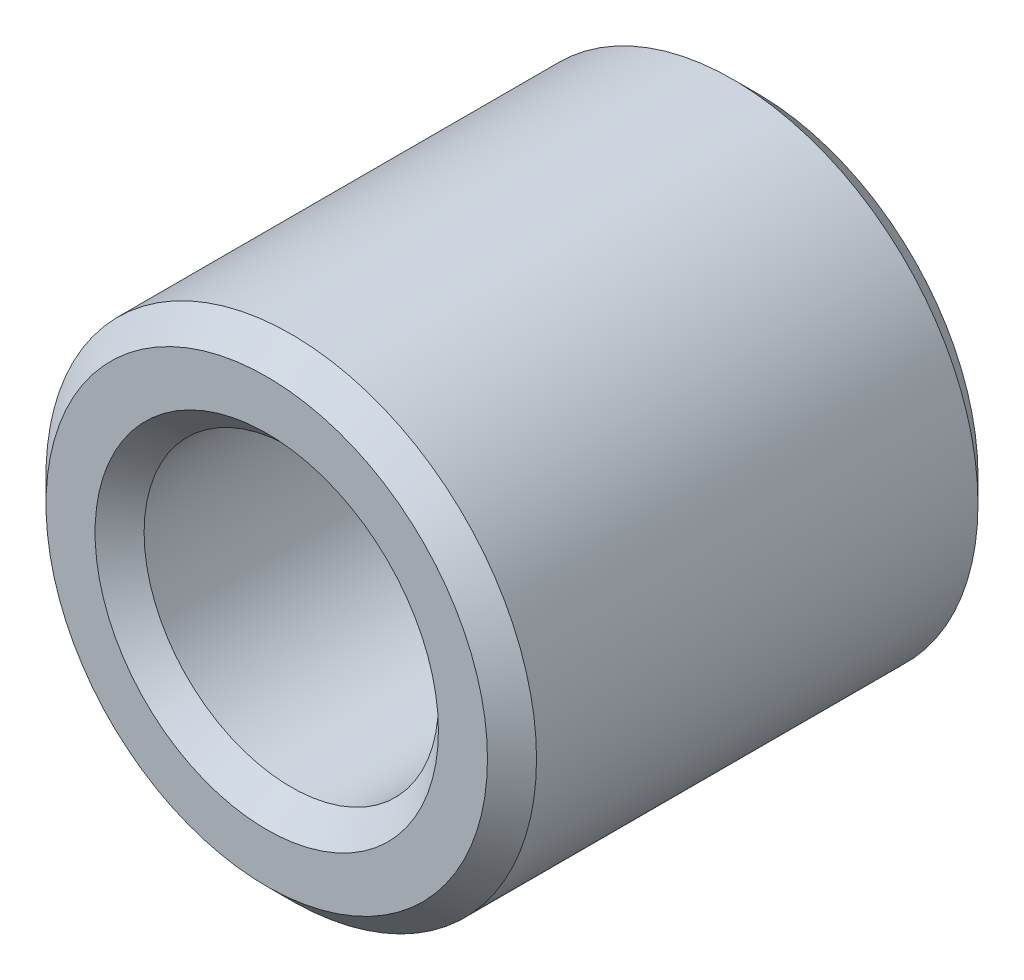
ISO-10303-21;
HEADER;
FILE_DESCRIPTION(('STEP AP214'),'2;1');
FILE_NAME('part.step','',(''),(''),'','','');
FILE_SCHEMA(('AUTOMOTIVE_DESIGN { 1 0 10303 214 1 1 1 1 }'));
ENDSEC;
DATA;
#1=APPLICATION_CONTEXT('core data for automotive mechanical design processes');
#2=APPLICATION_PROTOCOL_DEFINITION('international standard','automotive_design',2000,#1);
#3=PRODUCT_CONTEXT('',#1,'mechanical');
#4=PRODUCT('Part','Part','',(#3));
#5=PRODUCT_RELATED_PRODUCT_CATEGORY('part','',(#4));
#6=PRODUCT_DEFINITION_FORMATION('','',#4);
#7=PRODUCT_DEFINITION_CONTEXT('part definition',#1,'design');
#8=PRODUCT_DEFINITION('design','',#6,#7);
#9=PRODUCT_DEFINITION_SHAPE('','',#8);
#10=(LENGTH_UNIT() NAMED_UNIT(*) SI_UNIT(.MILLI.,.METRE.));
#11=(NAMED_UNIT(*) PLANE_ANGLE_UNIT() SI_UNIT($,.RADIAN.));
#12=(NAMED_UNIT(*) SI_UNIT($,.STERADIAN.) SOLID_ANGLE_UNIT());
#13=UNCERTAINTY_MEASURE_WITH_UNIT(LENGTH_MEASURE(1.E-05),#10,'distance_accuracy_value','');
#14=(GEOMETRIC_REPRESENTATION_CONTEXT(3) GLOBAL_UNCERTAINTY_ASSIGNED_CONTEXT((#13)) GLOBAL_UNIT_ASSIGNED_CONTEXT((#10,
#11,#12)) REPRESENTATION_CONTEXT('',''));
#15=CARTESIAN_POINT('',(0.,0.,0.));
#16=DIRECTION('',(0.,0.,1.));
#17=DIRECTION('',(1.,0.,0.));
#18=AXIS2_PLACEMENT_3D('',#15,#16,#17);
#19=CARTESIAN_POINT('',(0.,0.,10.));
#20=DIRECTION('',(0.,0.,1.));
#21=DIRECTION('',(1.,0.,0.));
#22=AXIS2_PLACEMENT_3D('',#19,#20,#21);
#23=PLANE('',#22);
#24=CARTESIAN_POINT('',(0.,0.,10.));
#25=DIRECTION('',(0.,0.,1.));
#26=DIRECTION('',(1.,0.,0.));
#27=AXIS2_PLACEMENT_3D('',#24,#25,#26);
#28=CIRCLE('',#27,3.50000000000001);
#29=CARTESIAN_POINT('',(3.50000000000001,0.,10.));
#30=VERTEX_POINT('',#29);
#31=EDGE_CURVE('E10',#30,#30,#28,.F.);
#32=ORIENTED_EDGE('',*,*,#31,.T.);
#33=EDGE_LOOP('',(#32));
#34=FACE_BOUND('',#33,.T.);
#35=CARTESIAN_POINT('',(0.,0.,10.));
#36=DIRECTION('',(0.,0.,1.));
#37=DIRECTION('',(1.,0.,0.));
#38=AXIS2_PLACEMENT_3D('',#35,#36,#37);
#39=CIRCLE('',#38,4.5);
#40=CARTESIAN_POINT('',(4.5,0.,10.));
#41=VERTEX_POINT('',#40);
#42=EDGE_CURVE('E36',#41,#41,#39,.T.);
#43=ORIENTED_EDGE('',*,*,#42,.T.);
#44=EDGE_LOOP('',(#43));
#45=FACE_BOUND('',#44,.T.);
#46=ADVANCED_FACE('F29',(#34,#45),#23,.T.);
#47=CARTESIAN_POINT('',(0.,0.,0.));
#48=DIRECTION('',(0.,0.,1.));
#49=DIRECTION('',(1.,0.,0.));
#50=AXIS2_PLACEMENT_3D('',#47,#48,#49);
#51=PLANE('',#50);
#52=CARTESIAN_POINT('',(0.,0.,0.));
#53=DIRECTION('',(0.,0.,1.));
#54=DIRECTION('',(1.,0.,0.));
#55=AXIS2_PLACEMENT_3D('',#52,#53,#54);
#56=CIRCLE('',#55,4.5);
#57=CARTESIAN_POINT('',(4.5,0.,0.));
#58=VERTEX_POINT('',#57);
#59=EDGE_CURVE('E49',#58,#58,#56,.F.);
#60=ORIENTED_EDGE('',*,*,#59,.T.);
#61=EDGE_LOOP('',(#60));
#62=FACE_BOUND('',#61,.T.);
#63=CARTESIAN_POINT('',(0.,0.,0.));
#64=DIRECTION('',(0.,0.,1.));
#65=DIRECTION('',(1.,0.,0.));
#66=AXIS2_PLACEMENT_3D('',#63,#64,#65);
#67=CIRCLE('',#66,3.5);
#68=CARTESIAN_POINT('',(3.5,0.,0.));
#69=VERTEX_POINT('',#68);
#70=EDGE_CURVE('E52',#69,#69,#67,.T.);
#71=ORIENTED_EDGE('',*,*,#70,.T.);
#72=EDGE_LOOP('',(#71));
#73=FACE_BOUND('',#72,.T.);
#74=ADVANCED_FACE('F73',(#62,#73),#51,.F.);
#75=CARTESIAN_POINT('',(0.,0.,10.));
#76=DIRECTION('',(0.,0.,-1.));
#77=DIRECTION('',(-1.,0.,0.));
#78=AXIS2_PLACEMENT_3D('',#75,#76,#77);
#79=CYLINDRICAL_SURFACE('',#78,5.);
#80=CARTESIAN_POINT('',(0.,0.,0.5));
#81=DIRECTION('',(0.,0.,1.));
#82=DIRECTION('',(1.,0.,0.));
#83=AXIS2_PLACEMENT_3D('',#80,#81,#82);
#84=CIRCLE('',#83,5.);
#85=CARTESIAN_POINT('',(5.,0.,0.5));
#86=VERTEX_POINT('',#85);
#87=EDGE_CURVE('E55',#86,#86,#84,.T.);
#88=ORIENTED_EDGE('',*,*,#87,.T.);
#89=EDGE_LOOP('',(#88));
#90=FACE_BOUND('',#89,.T.);
#91=CARTESIAN_POINT('',(0.,0.,9.5));
#92=DIRECTION('',(0.,0.,1.));
#93=DIRECTION('',(1.,0.,0.));
#94=AXIS2_PLACEMENT_3D('',#91,#92,#93);
#95=CIRCLE('',#94,5.);
#96=CARTESIAN_POINT('',(5.,0.,9.5));
#97=VERTEX_POINT('',#96);
#98=EDGE_CURVE('E58',#97,#97,#95,.F.);
#99=ORIENTED_EDGE('',*,*,#98,.T.);
#100=EDGE_LOOP('',(#99));
#101=FACE_BOUND('',#100,.T.);
#102=ADVANCED_FACE('F62',(#90,#101),#79,.T.);
#103=CARTESIAN_POINT('',(0.,0.,10.));
#104=DIRECTION('',(0.,0.,-1.));
#105=DIRECTION('',(-1.,0.,0.));
#106=AXIS2_PLACEMENT_3D('',#103,#104,#105);
#107=CYLINDRICAL_SURFACE('',#106,3.);
#108=CARTESIAN_POINT('',(0.,0.,0.5));
#109=DIRECTION('',(0.,0.,1.));
#110=DIRECTION('',(1.,0.,0.));
#111=AXIS2_PLACEMENT_3D('',#108,#109,#110);
#112=CIRCLE('',#111,3.);
#113=CARTESIAN_POINT('',(3.,0.,0.5));
#114=VERTEX_POINT('',#113);
#115=EDGE_CURVE('E40',#114,#114,#112,.F.);
#116=ORIENTED_EDGE('',*,*,#115,.T.);
#117=EDGE_LOOP('',(#116));
#118=FACE_BOUND('',#117,.T.);
#119=CARTESIAN_POINT('',(0.,0.,9.5));
#120=DIRECTION('',(0.,0.,1.));
#121=DIRECTION('',(1.,0.,0.));
#122=AXIS2_PLACEMENT_3D('',#119,#120,#121);
#123=CIRCLE('',#122,3.);
#124=CARTESIAN_POINT('',(3.,0.,9.5));
#125=VERTEX_POINT('',#124);
#126=EDGE_CURVE('E44',#125,#125,#123,.T.);
#127=ORIENTED_EDGE('',*,*,#126,.T.);
#128=EDGE_LOOP('',(#127));
#129=FACE_BOUND('',#128,.T.);
#130=ADVANCED_FACE('F81',(#118,#129),#107,.F.);
#131=CARTESIAN_POINT('',(0.,0.,0.5));
#132=DIRECTION('',(0.,0.,1.));
#133=DIRECTION('',(1.,0.,0.));
#134=AXIS2_PLACEMENT_3D('',#131,#132,#133);
#135=CONICAL_SURFACE('',#134,5.,0.785398163397451);
#136=ORIENTED_EDGE('',*,*,#59,.F.);
#137=EDGE_LOOP('',(#136));
#138=FACE_BOUND('',#137,.T.);
#139=ORIENTED_EDGE('',*,*,#87,.F.);
#140=EDGE_LOOP('',(#139));
#141=FACE_BOUND('',#140,.T.);
#142=ADVANCED_FACE('F86',(#138,#141),#135,.T.);
#143=CARTESIAN_POINT('',(0.,0.,0.));
#144=DIRECTION('',(0.,0.,-1.));
#145=DIRECTION('',(-1.,0.,0.));
#146=AXIS2_PLACEMENT_3D('',#143,#144,#145);
#147=CONICAL_SURFACE('',#146,3.5,0.785398163397445);
#148=ORIENTED_EDGE('',*,*,#115,.F.);
#149=EDGE_LOOP('',(#148));
#150=FACE_BOUND('',#149,.T.);
#151=ORIENTED_EDGE('',*,*,#70,.F.);
#152=EDGE_LOOP('',(#151));
#153=FACE_BOUND('',#152,.T.);
#154=ADVANCED_FACE('F70',(#150,#153),#147,.F.);
#155=CARTESIAN_POINT('',(0.,0.,9.5));
#156=DIRECTION('',(0.,0.,1.));
#157=DIRECTION('',(1.,0.,0.));
#158=AXIS2_PLACEMENT_3D('',#155,#156,#157);
#159=CONICAL_SURFACE('',#158,3.,0.785398163397453);
#160=ORIENTED_EDGE('',*,*,#31,.F.);
#161=EDGE_LOOP('',(#160));
#162=FACE_BOUND('',#161,.T.);
#163=ORIENTED_EDGE('',*,*,#126,.F.);
#164=EDGE_LOOP('',(#163));
#165=FACE_BOUND('',#164,.T.);
#166=ADVANCED_FACE('F66',(#162,#165),#159,.F.);
#167=CARTESIAN_POINT('',(0.,0.,10.));
#168=DIRECTION('',(0.,0.,-1.));
#169=DIRECTION('',(-1.,0.,0.));
#170=AXIS2_PLACEMENT_3D('',#167,#168,#169);
#171=CONICAL_SURFACE('',#170,4.5,0.785398163397444);
#172=ORIENTED_EDGE('',*,*,#98,.F.);
#173=EDGE_LOOP('',(#172));
#174=FACE_BOUND('',#173,.T.);
#175=ORIENTED_EDGE('',*,*,#42,.F.);
#176=EDGE_LOOP('',(#175));
#177=FACE_BOUND('',#176,.T.);
#178=ADVANCED_FACE('F31',(#174,#177),#171,.T.);
#179=CLOSED_SHELL('',(#46,#74,#102,#130,#142,#154,#166,#178));
#180=MANIFOLD_SOLID_BREP('B2',#179);
#181=ADVANCED_BREP_SHAPE_REPRESENTATION('',(#18,#180),#14);
#182=SHAPE_DEFINITION_REPRESENTATION(#9,#181);
ENDSEC;
END-ISO-10303-21;
